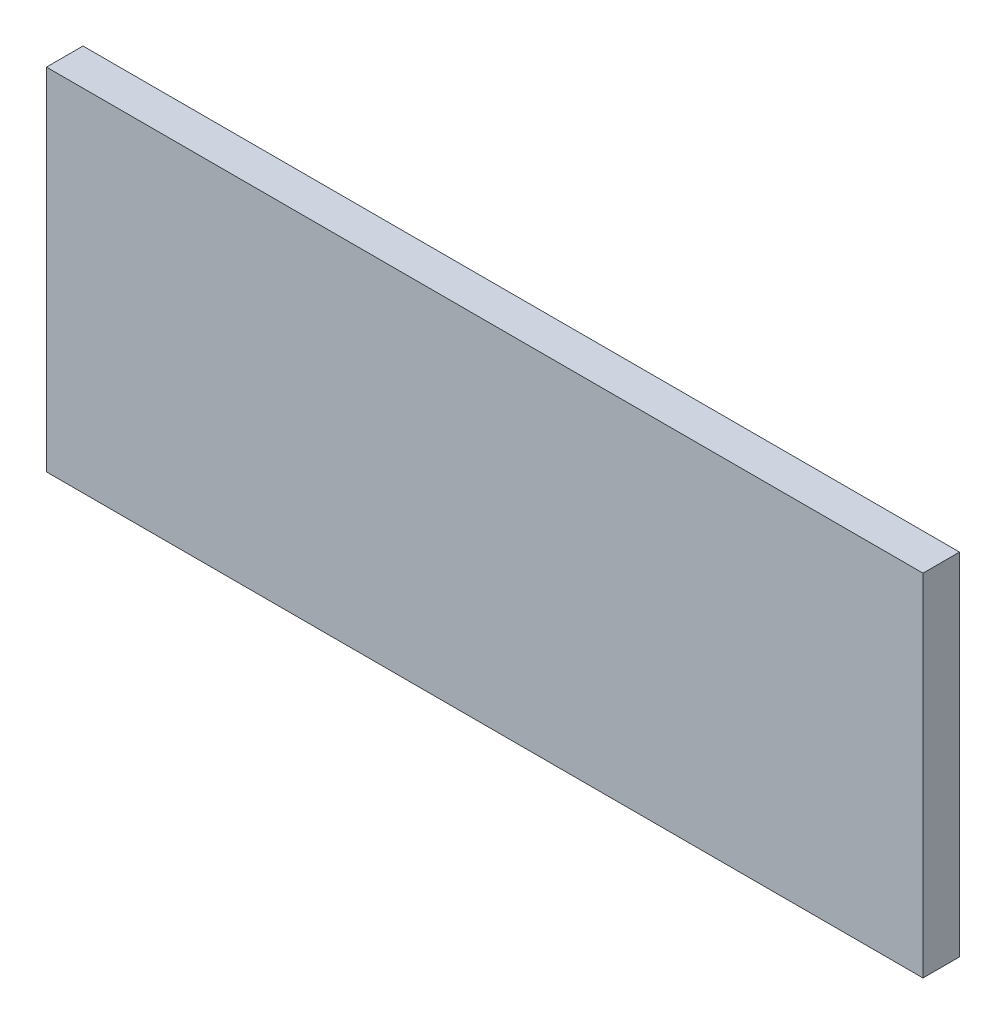
ISO-10303-21;
HEADER;
FILE_DESCRIPTION(('STEP AP214'),'2;1');
FILE_NAME('part.step','',(''),(''),'','','');
FILE_SCHEMA(('AUTOMOTIVE_DESIGN { 1 0 10303 214 1 1 1 1 }'));
ENDSEC;
DATA;
#1=APPLICATION_CONTEXT('core data for automotive mechanical design processes');
#2=APPLICATION_PROTOCOL_DEFINITION('international standard','automotive_design',2000,#1);
#3=PRODUCT_CONTEXT('',#1,'mechanical');
#4=PRODUCT('Part','Part','',(#3));
#5=PRODUCT_RELATED_PRODUCT_CATEGORY('part','',(#4));
#6=PRODUCT_DEFINITION_FORMATION('','',#4);
#7=PRODUCT_DEFINITION_CONTEXT('part definition',#1,'design');
#8=PRODUCT_DEFINITION('design','',#6,#7);
#9=PRODUCT_DEFINITION_SHAPE('','',#8);
#10=(LENGTH_UNIT() NAMED_UNIT(*) SI_UNIT(.MILLI.,.METRE.));
#11=(NAMED_UNIT(*) PLANE_ANGLE_UNIT() SI_UNIT($,.RADIAN.));
#12=(NAMED_UNIT(*) SI_UNIT($,.STERADIAN.) SOLID_ANGLE_UNIT());
#13=UNCERTAINTY_MEASURE_WITH_UNIT(LENGTH_MEASURE(1.E-05),#10,'distance_accuracy_value','');
#14=(GEOMETRIC_REPRESENTATION_CONTEXT(3) GLOBAL_UNCERTAINTY_ASSIGNED_CONTEXT((#13)) GLOBAL_UNIT_ASSIGNED_CONTEXT((#10,
#11,#12)) REPRESENTATION_CONTEXT('',''));
#15=CARTESIAN_POINT('',(0.,0.,0.));
#16=DIRECTION('',(0.,0.,1.));
#17=DIRECTION('',(1.,0.,0.));
#18=AXIS2_PLACEMENT_3D('',#15,#16,#17);
#19=CARTESIAN_POINT('',(0.,0.,3.175));
#20=DIRECTION('',(-1.,0.,0.));
#21=DIRECTION('',(0.,0.,1.));
#22=AXIS2_PLACEMENT_3D('',#19,#20,#21);
#23=PLANE('',#22);
#24=DIRECTION('',(0.,1.,0.));
#25=VECTOR('',#24,1.);
#26=CARTESIAN_POINT('',(0.,0.,0.));
#27=LINE('',#26,#25);
#28=CARTESIAN_POINT('',(0.,0.,0.));
#29=VERTEX_POINT('',#28);
#30=CARTESIAN_POINT('',(0.,30.48,0.));
#31=VERTEX_POINT('',#30);
#32=EDGE_CURVE('E113',#29,#31,#27,.T.);
#33=ORIENTED_EDGE('',*,*,#32,.T.);
#34=DIRECTION('',(0.,0.,-1.));
#35=VECTOR('',#34,1.);
#36=CARTESIAN_POINT('',(0.,30.48,3.175));
#37=LINE('',#36,#35);
#38=CARTESIAN_POINT('',(0.,30.48,3.175));
#39=VERTEX_POINT('',#38);
#40=EDGE_CURVE('E11',#39,#31,#37,.T.);
#41=ORIENTED_EDGE('',*,*,#40,.F.);
#42=DIRECTION('',(0.,1.,0.));
#43=VECTOR('',#42,1.);
#44=CARTESIAN_POINT('',(0.,0.,3.175));
#45=LINE('',#44,#43);
#46=CARTESIAN_POINT('',(0.,0.,3.175));
#47=VERTEX_POINT('',#46);
#48=EDGE_CURVE('E97',#47,#39,#45,.T.);
#49=ORIENTED_EDGE('',*,*,#48,.F.);
#50=DIRECTION('',(0.,0.,-1.));
#51=VECTOR('',#50,1.);
#52=CARTESIAN_POINT('',(0.,0.,3.175));
#53=LINE('',#52,#51);
#54=EDGE_CURVE('E109',#47,#29,#53,.T.);
#55=ORIENTED_EDGE('',*,*,#54,.T.);
#56=EDGE_LOOP('',(#33,#41,#49,#55));
#57=FACE_BOUND('',#56,.T.);
#58=ADVANCED_FACE('F45',(#57),#23,.F.);
#59=CARTESIAN_POINT('',(0.,30.48,3.175));
#60=DIRECTION('',(0.,-1.,0.));
#61=DIRECTION('',(1.,0.,0.));
#62=AXIS2_PLACEMENT_3D('',#59,#60,#61);
#63=PLANE('',#62);
#64=DIRECTION('',(-1.,0.,0.));
#65=VECTOR('',#64,1.);
#66=CARTESIAN_POINT('',(0.,30.48,0.));
#67=LINE('',#66,#65);
#68=CARTESIAN_POINT('',(-76.2,30.48,0.));
#69=VERTEX_POINT('',#68);
#70=EDGE_CURVE('E102',#31,#69,#67,.T.);
#71=ORIENTED_EDGE('',*,*,#70,.T.);
#72=DIRECTION('',(0.,0.,-1.));
#73=VECTOR('',#72,1.);
#74=CARTESIAN_POINT('',(-76.2,30.48,3.175));
#75=LINE('',#74,#73);
#76=CARTESIAN_POINT('',(-76.2,30.48,3.175));
#77=VERTEX_POINT('',#76);
#78=EDGE_CURVE('E54',#77,#69,#75,.T.);
#79=ORIENTED_EDGE('',*,*,#78,.F.);
#80=DIRECTION('',(-1.,0.,0.));
#81=VECTOR('',#80,1.);
#82=CARTESIAN_POINT('',(0.,30.48,3.175));
#83=LINE('',#82,#81);
#84=EDGE_CURVE('E92',#39,#77,#83,.T.);
#85=ORIENTED_EDGE('',*,*,#84,.F.);
#86=ORIENTED_EDGE('',*,*,#40,.T.);
#87=EDGE_LOOP('',(#71,#79,#85,#86));
#88=FACE_BOUND('',#87,.T.);
#89=ADVANCED_FACE('F101',(#88),#63,.F.);
#90=CARTESIAN_POINT('',(-76.2,0.,3.175));
#91=DIRECTION('',(1.,0.,0.));
#92=DIRECTION('',(0.,0.,-1.));
#93=AXIS2_PLACEMENT_3D('',#90,#91,#92);
#94=PLANE('',#93);
#95=DIRECTION('',(0.,-1.,0.));
#96=VECTOR('',#95,1.);
#97=CARTESIAN_POINT('',(-76.2,0.,0.));
#98=LINE('',#97,#96);
#99=CARTESIAN_POINT('',(-76.2,0.,0.));
#100=VERTEX_POINT('',#99);
#101=EDGE_CURVE('E79',#69,#100,#98,.T.);
#102=ORIENTED_EDGE('',*,*,#101,.T.);
#103=DIRECTION('',(0.,0.,-1.));
#104=VECTOR('',#103,1.);
#105=CARTESIAN_POINT('',(-76.2,0.,3.175));
#106=LINE('',#105,#104);
#107=CARTESIAN_POINT('',(-76.2,0.,3.175));
#108=VERTEX_POINT('',#107);
#109=EDGE_CURVE('E104',#108,#100,#106,.T.);
#110=ORIENTED_EDGE('',*,*,#109,.F.);
#111=DIRECTION('',(0.,-1.,0.));
#112=VECTOR('',#111,1.);
#113=CARTESIAN_POINT('',(-76.2,0.,3.175));
#114=LINE('',#113,#112);
#115=EDGE_CURVE('E95',#77,#108,#114,.T.);
#116=ORIENTED_EDGE('',*,*,#115,.F.);
#117=ORIENTED_EDGE('',*,*,#78,.T.);
#118=EDGE_LOOP('',(#102,#110,#116,#117));
#119=FACE_BOUND('',#118,.T.);
#120=ADVANCED_FACE('F105',(#119),#94,.F.);
#121=CARTESIAN_POINT('',(0.,0.,3.175));
#122=DIRECTION('',(0.,1.,0.));
#123=DIRECTION('',(-1.,0.,0.));
#124=AXIS2_PLACEMENT_3D('',#121,#122,#123);
#125=PLANE('',#124);
#126=DIRECTION('',(1.,0.,0.));
#127=VECTOR('',#126,1.);
#128=CARTESIAN_POINT('',(0.,0.,0.));
#129=LINE('',#128,#127);
#130=EDGE_CURVE('E85',#100,#29,#129,.T.);
#131=ORIENTED_EDGE('',*,*,#130,.T.);
#132=ORIENTED_EDGE('',*,*,#54,.F.);
#133=DIRECTION('',(1.,0.,0.));
#134=VECTOR('',#133,1.);
#135=CARTESIAN_POINT('',(0.,0.,3.175));
#136=LINE('',#135,#134);
#137=EDGE_CURVE('E62',#108,#47,#136,.T.);
#138=ORIENTED_EDGE('',*,*,#137,.F.);
#139=ORIENTED_EDGE('',*,*,#109,.T.);
#140=EDGE_LOOP('',(#131,#132,#138,#139));
#141=FACE_BOUND('',#140,.T.);
#142=ADVANCED_FACE('F126',(#141),#125,.F.);
#143=CARTESIAN_POINT('',(0.,0.,3.175));
#144=DIRECTION('',(0.,0.,1.));
#145=DIRECTION('',(1.,0.,0.));
#146=AXIS2_PLACEMENT_3D('',#143,#144,#145);
#147=PLANE('',#146);
#148=ORIENTED_EDGE('',*,*,#48,.T.);
#149=ORIENTED_EDGE('',*,*,#84,.T.);
#150=ORIENTED_EDGE('',*,*,#115,.T.);
#151=ORIENTED_EDGE('',*,*,#137,.T.);
#152=EDGE_LOOP('',(#148,#149,#150,#151));
#153=FACE_BOUND('',#152,.T.);
#154=ADVANCED_FACE('F93',(#153),#147,.T.);
#155=CARTESIAN_POINT('',(0.,0.,0.));
#156=DIRECTION('',(0.,0.,1.));
#157=DIRECTION('',(1.,0.,0.));
#158=AXIS2_PLACEMENT_3D('',#155,#156,#157);
#159=PLANE('',#158);
#160=ORIENTED_EDGE('',*,*,#32,.F.);
#161=ORIENTED_EDGE('',*,*,#130,.F.);
#162=ORIENTED_EDGE('',*,*,#101,.F.);
#163=ORIENTED_EDGE('',*,*,#70,.F.);
#164=EDGE_LOOP('',(#160,#161,#162,#163));
#165=FACE_BOUND('',#164,.T.);
#166=ADVANCED_FACE('F129',(#165),#159,.F.);
#167=CLOSED_SHELL('',(#58,#89,#120,#142,#154,#166));
#168=MANIFOLD_SOLID_BREP('B2',#167);
#169=ADVANCED_BREP_SHAPE_REPRESENTATION('',(#18,#168),#14);
#170=SHAPE_DEFINITION_REPRESENTATION(#9,#169);
ENDSEC;
END-ISO-10303-21;
